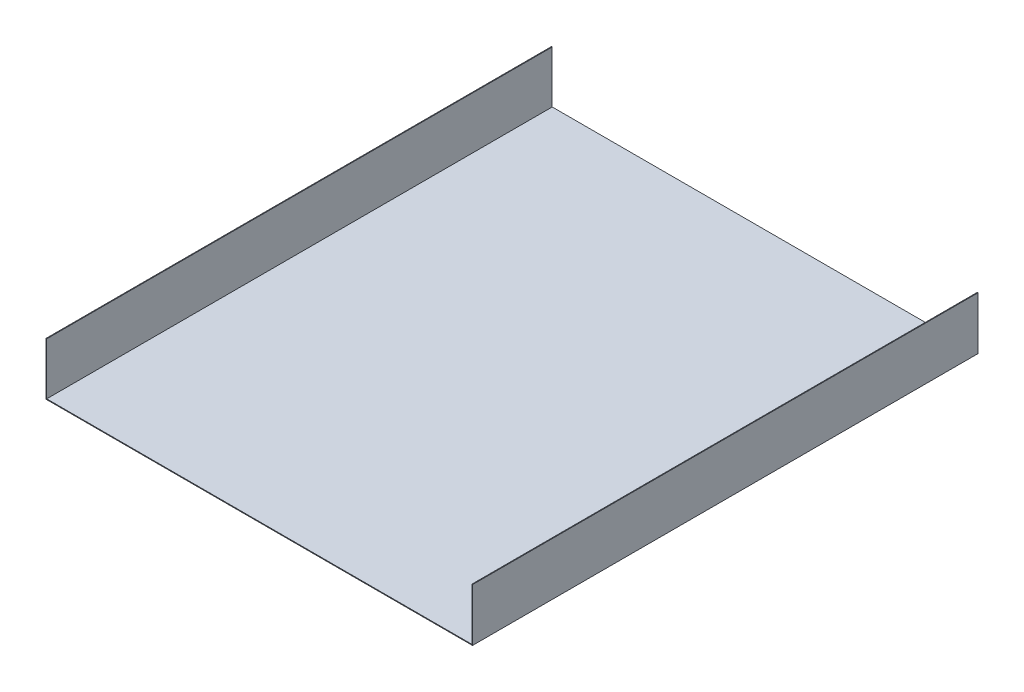
ISO-10303-21;
HEADER;
FILE_DESCRIPTION(('STEP AP214'),'2;1');
FILE_NAME('part.step','',(''),(''),'','','');
FILE_SCHEMA(('AUTOMOTIVE_DESIGN { 1 0 10303 214 1 1 1 1 }'));
ENDSEC;
DATA;
#1=APPLICATION_CONTEXT('core data for automotive mechanical design processes');
#2=APPLICATION_PROTOCOL_DEFINITION('international standard','automotive_design',2000,#1);
#3=PRODUCT_CONTEXT('',#1,'mechanical');
#4=PRODUCT('Part','Part','',(#3));
#5=PRODUCT_RELATED_PRODUCT_CATEGORY('part','',(#4));
#6=PRODUCT_DEFINITION_FORMATION('','',#4);
#7=PRODUCT_DEFINITION_CONTEXT('part definition',#1,'design');
#8=PRODUCT_DEFINITION('design','',#6,#7);
#9=PRODUCT_DEFINITION_SHAPE('','',#8);
#10=(LENGTH_UNIT() NAMED_UNIT(*) SI_UNIT(.MILLI.,.METRE.));
#11=(NAMED_UNIT(*) PLANE_ANGLE_UNIT() SI_UNIT($,.RADIAN.));
#12=(NAMED_UNIT(*) SI_UNIT($,.STERADIAN.) SOLID_ANGLE_UNIT());
#13=UNCERTAINTY_MEASURE_WITH_UNIT(LENGTH_MEASURE(1.E-05),#10,'distance_accuracy_value','');
#14=(GEOMETRIC_REPRESENTATION_CONTEXT(3) GLOBAL_UNCERTAINTY_ASSIGNED_CONTEXT((#13)) GLOBAL_UNIT_ASSIGNED_CONTEXT((#10,
#11,#12)) REPRESENTATION_CONTEXT('',''));
#15=CARTESIAN_POINT('',(0.,0.,0.));
#16=DIRECTION('',(0.,0.,1.));
#17=DIRECTION('',(1.,0.,0.));
#18=AXIS2_PLACEMENT_3D('',#15,#16,#17);
#19=CARTESIAN_POINT('',(14.7,81.,-700.));
#20=DIRECTION('',(0.,1.,0.));
#21=DIRECTION('',(0.,0.,1.));
#22=AXIS2_PLACEMENT_3D('',#19,#20,#21);
#23=PLANE('',#22);
#24=DIRECTION('',(-1.,0.,0.));
#25=VECTOR('',#24,1.);
#26=CARTESIAN_POINT('',(14.7,81.,0.));
#27=LINE('',#26,#25);
#28=CARTESIAN_POINT('',(14.7,81.,0.));
#29=VERTEX_POINT('',#28);
#30=CARTESIAN_POINT('',(13.7,81.,0.));
#31=VERTEX_POINT('',#30);
#32=EDGE_CURVE('E136',#29,#31,#27,.T.);
#33=ORIENTED_EDGE('',*,*,#32,.F.);
#34=DIRECTION('',(0.,0.,1.));
#35=VECTOR('',#34,1.);
#36=CARTESIAN_POINT('',(14.7,81.,-700.));
#37=LINE('',#36,#35);
#38=CARTESIAN_POINT('',(14.7,81.,-700.));
#39=VERTEX_POINT('',#38);
#40=EDGE_CURVE('E11',#39,#29,#37,.T.);
#41=ORIENTED_EDGE('',*,*,#40,.F.);
#42=DIRECTION('',(-1.,0.,0.));
#43=VECTOR('',#42,1.);
#44=CARTESIAN_POINT('',(14.7,81.,-700.));
#45=LINE('',#44,#43);
#46=CARTESIAN_POINT('',(13.7,81.,-700.));
#47=VERTEX_POINT('',#46);
#48=EDGE_CURVE('E156',#39,#47,#45,.T.);
#49=ORIENTED_EDGE('',*,*,#48,.T.);
#50=DIRECTION('',(0.,0.,1.));
#51=VECTOR('',#50,1.);
#52=CARTESIAN_POINT('',(13.7,81.,-700.));
#53=LINE('',#52,#51);
#54=EDGE_CURVE('E42',#47,#31,#53,.T.);
#55=ORIENTED_EDGE('',*,*,#54,.T.);
#56=EDGE_LOOP('',(#33,#41,#49,#55));
#57=FACE_BOUND('',#56,.T.);
#58=ADVANCED_FACE('F39',(#57),#23,.T.);
#59=CARTESIAN_POINT('',(14.7,9.,-700.));
#60=DIRECTION('',(1.,0.,0.));
#61=DIRECTION('',(0.,0.,-1.));
#62=AXIS2_PLACEMENT_3D('',#59,#60,#61);
#63=PLANE('',#62);
#64=DIRECTION('',(0.,1.,0.));
#65=VECTOR('',#64,1.);
#66=CARTESIAN_POINT('',(14.7,9.,0.));
#67=LINE('',#66,#65);
#68=CARTESIAN_POINT('',(14.7,9.,0.));
#69=VERTEX_POINT('',#68);
#70=EDGE_CURVE('E154',#69,#29,#67,.T.);
#71=ORIENTED_EDGE('',*,*,#70,.F.);
#72=DIRECTION('',(0.,0.,1.));
#73=VECTOR('',#72,1.);
#74=CARTESIAN_POINT('',(14.7,9.,-700.));
#75=LINE('',#74,#73);
#76=CARTESIAN_POINT('',(14.7,9.,-700.));
#77=VERTEX_POINT('',#76);
#78=EDGE_CURVE('E48',#77,#69,#75,.T.);
#79=ORIENTED_EDGE('',*,*,#78,.F.);
#80=DIRECTION('',(0.,1.,0.));
#81=VECTOR('',#80,1.);
#82=CARTESIAN_POINT('',(14.7,9.,-700.));
#83=LINE('',#82,#81);
#84=EDGE_CURVE('E126',#77,#39,#83,.T.);
#85=ORIENTED_EDGE('',*,*,#84,.T.);
#86=ORIENTED_EDGE('',*,*,#40,.T.);
#87=EDGE_LOOP('',(#71,#79,#85,#86));
#88=FACE_BOUND('',#87,.T.);
#89=ADVANCED_FACE('F168',(#88),#63,.T.);
#90=CARTESIAN_POINT('',(603.3,9.,-700.));
#91=DIRECTION('',(0.,1.,0.));
#92=DIRECTION('',(0.,0.,1.));
#93=AXIS2_PLACEMENT_3D('',#90,#91,#92);
#94=PLANE('',#93);
#95=DIRECTION('',(-1.,0.,0.));
#96=VECTOR('',#95,1.);
#97=CARTESIAN_POINT('',(603.3,9.,0.));
#98=LINE('',#97,#96);
#99=CARTESIAN_POINT('',(603.3,9.,0.));
#100=VERTEX_POINT('',#99);
#101=EDGE_CURVE('E113',#100,#69,#98,.T.);
#102=ORIENTED_EDGE('',*,*,#101,.F.);
#103=DIRECTION('',(0.,0.,1.));
#104=VECTOR('',#103,1.);
#105=CARTESIAN_POINT('',(603.3,9.,-700.));
#106=LINE('',#105,#104);
#107=CARTESIAN_POINT('',(603.3,9.,-700.));
#108=VERTEX_POINT('',#107);
#109=EDGE_CURVE('E108',#108,#100,#106,.T.);
#110=ORIENTED_EDGE('',*,*,#109,.F.);
#111=DIRECTION('',(-1.,0.,0.));
#112=VECTOR('',#111,1.);
#113=CARTESIAN_POINT('',(603.3,9.,-700.));
#114=LINE('',#113,#112);
#115=EDGE_CURVE('E111',#108,#77,#114,.T.);
#116=ORIENTED_EDGE('',*,*,#115,.T.);
#117=ORIENTED_EDGE('',*,*,#78,.T.);
#118=EDGE_LOOP('',(#102,#110,#116,#117));
#119=FACE_BOUND('',#118,.T.);
#120=ADVANCED_FACE('F110',(#119),#94,.T.);
#121=CARTESIAN_POINT('',(603.3,81.,-700.));
#122=DIRECTION('',(-1.,0.,0.));
#123=DIRECTION('',(0.,0.,1.));
#124=AXIS2_PLACEMENT_3D('',#121,#122,#123);
#125=PLANE('',#124);
#126=DIRECTION('',(0.,-1.,0.));
#127=VECTOR('',#126,1.);
#128=CARTESIAN_POINT('',(603.3,81.,0.));
#129=LINE('',#128,#127);
#130=CARTESIAN_POINT('',(603.3,81.,0.));
#131=VERTEX_POINT('',#130);
#132=EDGE_CURVE('E151',#131,#100,#129,.T.);
#133=ORIENTED_EDGE('',*,*,#132,.F.);
#134=DIRECTION('',(0.,0.,1.));
#135=VECTOR('',#134,1.);
#136=CARTESIAN_POINT('',(603.3,81.,-700.));
#137=LINE('',#136,#135);
#138=CARTESIAN_POINT('',(603.3,81.,-700.));
#139=VERTEX_POINT('',#138);
#140=EDGE_CURVE('E118',#139,#131,#137,.T.);
#141=ORIENTED_EDGE('',*,*,#140,.F.);
#142=DIRECTION('',(0.,-1.,0.));
#143=VECTOR('',#142,1.);
#144=CARTESIAN_POINT('',(603.3,81.,-700.));
#145=LINE('',#144,#143);
#146=EDGE_CURVE('E124',#139,#108,#145,.T.);
#147=ORIENTED_EDGE('',*,*,#146,.T.);
#148=ORIENTED_EDGE('',*,*,#109,.T.);
#149=EDGE_LOOP('',(#133,#141,#147,#148));
#150=FACE_BOUND('',#149,.T.);
#151=ADVANCED_FACE('F128',(#150),#125,.T.);
#152=CARTESIAN_POINT('',(604.3,81.,-700.));
#153=DIRECTION('',(0.,1.,0.));
#154=DIRECTION('',(0.,0.,1.));
#155=AXIS2_PLACEMENT_3D('',#152,#153,#154);
#156=PLANE('',#155);
#157=DIRECTION('',(-1.,0.,0.));
#158=VECTOR('',#157,1.);
#159=CARTESIAN_POINT('',(604.3,81.,0.));
#160=LINE('',#159,#158);
#161=CARTESIAN_POINT('',(604.3,81.,0.));
#162=VERTEX_POINT('',#161);
#163=EDGE_CURVE('E148',#162,#131,#160,.T.);
#164=ORIENTED_EDGE('',*,*,#163,.F.);
#165=DIRECTION('',(0.,0.,1.));
#166=VECTOR('',#165,1.);
#167=CARTESIAN_POINT('',(604.3,81.,-700.));
#168=LINE('',#167,#166);
#169=CARTESIAN_POINT('',(604.3,81.,-700.));
#170=VERTEX_POINT('',#169);
#171=EDGE_CURVE('E160',#170,#162,#168,.T.);
#172=ORIENTED_EDGE('',*,*,#171,.F.);
#173=DIRECTION('',(-1.,0.,0.));
#174=VECTOR('',#173,1.);
#175=CARTESIAN_POINT('',(604.3,81.,-700.));
#176=LINE('',#175,#174);
#177=EDGE_CURVE('E129',#170,#139,#176,.T.);
#178=ORIENTED_EDGE('',*,*,#177,.T.);
#179=ORIENTED_EDGE('',*,*,#140,.T.);
#180=EDGE_LOOP('',(#164,#172,#178,#179));
#181=FACE_BOUND('',#180,.T.);
#182=ADVANCED_FACE('F181',(#181),#156,.T.);
#183=CARTESIAN_POINT('',(604.3,8.,-700.));
#184=DIRECTION('',(1.,0.,0.));
#185=DIRECTION('',(0.,0.,-1.));
#186=AXIS2_PLACEMENT_3D('',#183,#184,#185);
#187=PLANE('',#186);
#188=DIRECTION('',(0.,1.,0.));
#189=VECTOR('',#188,1.);
#190=CARTESIAN_POINT('',(604.3,8.,0.));
#191=LINE('',#190,#189);
#192=CARTESIAN_POINT('',(604.3,8.,0.));
#193=VERTEX_POINT('',#192);
#194=EDGE_CURVE('E145',#193,#162,#191,.T.);
#195=ORIENTED_EDGE('',*,*,#194,.F.);
#196=DIRECTION('',(0.,0.,1.));
#197=VECTOR('',#196,1.);
#198=CARTESIAN_POINT('',(604.3,8.,-700.));
#199=LINE('',#198,#197);
#200=CARTESIAN_POINT('',(604.3,8.,-700.));
#201=VERTEX_POINT('',#200);
#202=EDGE_CURVE('E162',#201,#193,#199,.T.);
#203=ORIENTED_EDGE('',*,*,#202,.F.);
#204=DIRECTION('',(0.,1.,0.));
#205=VECTOR('',#204,1.);
#206=CARTESIAN_POINT('',(604.3,8.,-700.));
#207=LINE('',#206,#205);
#208=EDGE_CURVE('E131',#201,#170,#207,.T.);
#209=ORIENTED_EDGE('',*,*,#208,.T.);
#210=ORIENTED_EDGE('',*,*,#171,.T.);
#211=EDGE_LOOP('',(#195,#203,#209,#210));
#212=FACE_BOUND('',#211,.T.);
#213=ADVANCED_FACE('F184',(#212),#187,.T.);
#214=CARTESIAN_POINT('',(13.7,8.,-700.));
#215=DIRECTION('',(0.,-1.,0.));
#216=DIRECTION('',(0.,0.,-1.));
#217=AXIS2_PLACEMENT_3D('',#214,#215,#216);
#218=PLANE('',#217);
#219=DIRECTION('',(1.,0.,0.));
#220=VECTOR('',#219,1.);
#221=CARTESIAN_POINT('',(13.7,8.,0.));
#222=LINE('',#221,#220);
#223=CARTESIAN_POINT('',(13.7,8.,0.));
#224=VERTEX_POINT('',#223);
#225=EDGE_CURVE('E142',#224,#193,#222,.T.);
#226=ORIENTED_EDGE('',*,*,#225,.F.);
#227=DIRECTION('',(0.,0.,1.));
#228=VECTOR('',#227,1.);
#229=CARTESIAN_POINT('',(13.7,8.,-700.));
#230=LINE('',#229,#228);
#231=CARTESIAN_POINT('',(13.7,8.,-700.));
#232=VERTEX_POINT('',#231);
#233=EDGE_CURVE('E163',#232,#224,#230,.T.);
#234=ORIENTED_EDGE('',*,*,#233,.F.);
#235=DIRECTION('',(1.,0.,0.));
#236=VECTOR('',#235,1.);
#237=CARTESIAN_POINT('',(13.7,8.,-700.));
#238=LINE('',#237,#236);
#239=EDGE_CURVE('E259',#232,#201,#238,.T.);
#240=ORIENTED_EDGE('',*,*,#239,.T.);
#241=ORIENTED_EDGE('',*,*,#202,.T.);
#242=EDGE_LOOP('',(#226,#234,#240,#241));
#243=FACE_BOUND('',#242,.T.);
#244=ADVANCED_FACE('F188',(#243),#218,.T.);
#245=CARTESIAN_POINT('',(13.7,81.,-700.));
#246=DIRECTION('',(-1.,0.,0.));
#247=DIRECTION('',(0.,0.,1.));
#248=AXIS2_PLACEMENT_3D('',#245,#246,#247);
#249=PLANE('',#248);
#250=DIRECTION('',(0.,-1.,0.));
#251=VECTOR('',#250,1.);
#252=CARTESIAN_POINT('',(13.7,81.,0.));
#253=LINE('',#252,#251);
#254=EDGE_CURVE('E139',#31,#224,#253,.T.);
#255=ORIENTED_EDGE('',*,*,#254,.F.);
#256=ORIENTED_EDGE('',*,*,#54,.F.);
#257=DIRECTION('',(0.,-1.,0.));
#258=VECTOR('',#257,1.);
#259=CARTESIAN_POINT('',(13.7,81.,-700.));
#260=LINE('',#259,#258);
#261=EDGE_CURVE('E260',#47,#232,#260,.T.);
#262=ORIENTED_EDGE('',*,*,#261,.T.);
#263=ORIENTED_EDGE('',*,*,#233,.T.);
#264=EDGE_LOOP('',(#255,#256,#262,#263));
#265=FACE_BOUND('',#264,.T.);
#266=ADVANCED_FACE('F165',(#265),#249,.T.);
#267=CARTESIAN_POINT('',(0.,0.,-700.));
#268=DIRECTION('',(0.,0.,1.));
#269=DIRECTION('',(1.,0.,0.));
#270=AXIS2_PLACEMENT_3D('',#267,#268,#269);
#271=PLANE('',#270);
#272=ORIENTED_EDGE('',*,*,#48,.F.);
#273=ORIENTED_EDGE('',*,*,#84,.F.);
#274=ORIENTED_EDGE('',*,*,#115,.F.);
#275=ORIENTED_EDGE('',*,*,#146,.F.);
#276=ORIENTED_EDGE('',*,*,#177,.F.);
#277=ORIENTED_EDGE('',*,*,#208,.F.);
#278=ORIENTED_EDGE('',*,*,#239,.F.);
#279=ORIENTED_EDGE('',*,*,#261,.F.);
#280=EDGE_LOOP('',(#272,#273,#274,#275,#276,#277,#278,#279));
#281=FACE_BOUND('',#280,.T.);
#282=ADVANCED_FACE('F122',(#281),#271,.F.);
#283=CARTESIAN_POINT('',(0.,0.,0.));
#284=DIRECTION('',(0.,0.,1.));
#285=DIRECTION('',(1.,0.,0.));
#286=AXIS2_PLACEMENT_3D('',#283,#284,#285);
#287=PLANE('',#286);
#288=ORIENTED_EDGE('',*,*,#32,.T.);
#289=ORIENTED_EDGE('',*,*,#254,.T.);
#290=ORIENTED_EDGE('',*,*,#225,.T.);
#291=ORIENTED_EDGE('',*,*,#194,.T.);
#292=ORIENTED_EDGE('',*,*,#163,.T.);
#293=ORIENTED_EDGE('',*,*,#132,.T.);
#294=ORIENTED_EDGE('',*,*,#101,.T.);
#295=ORIENTED_EDGE('',*,*,#70,.T.);
#296=EDGE_LOOP('',(#288,#289,#290,#291,#292,#293,#294,#295));
#297=FACE_BOUND('',#296,.T.);
#298=ADVANCED_FACE('F167',(#297),#287,.T.);
#299=CLOSED_SHELL('',(#58,#89,#120,#151,#182,#213,#244,#266,#282,#298));
#300=MANIFOLD_SOLID_BREP('B2',#299);
#301=ADVANCED_BREP_SHAPE_REPRESENTATION('',(#18,#300),#14);
#302=SHAPE_DEFINITION_REPRESENTATION(#9,#301);
ENDSEC;
END-ISO-10303-21;
